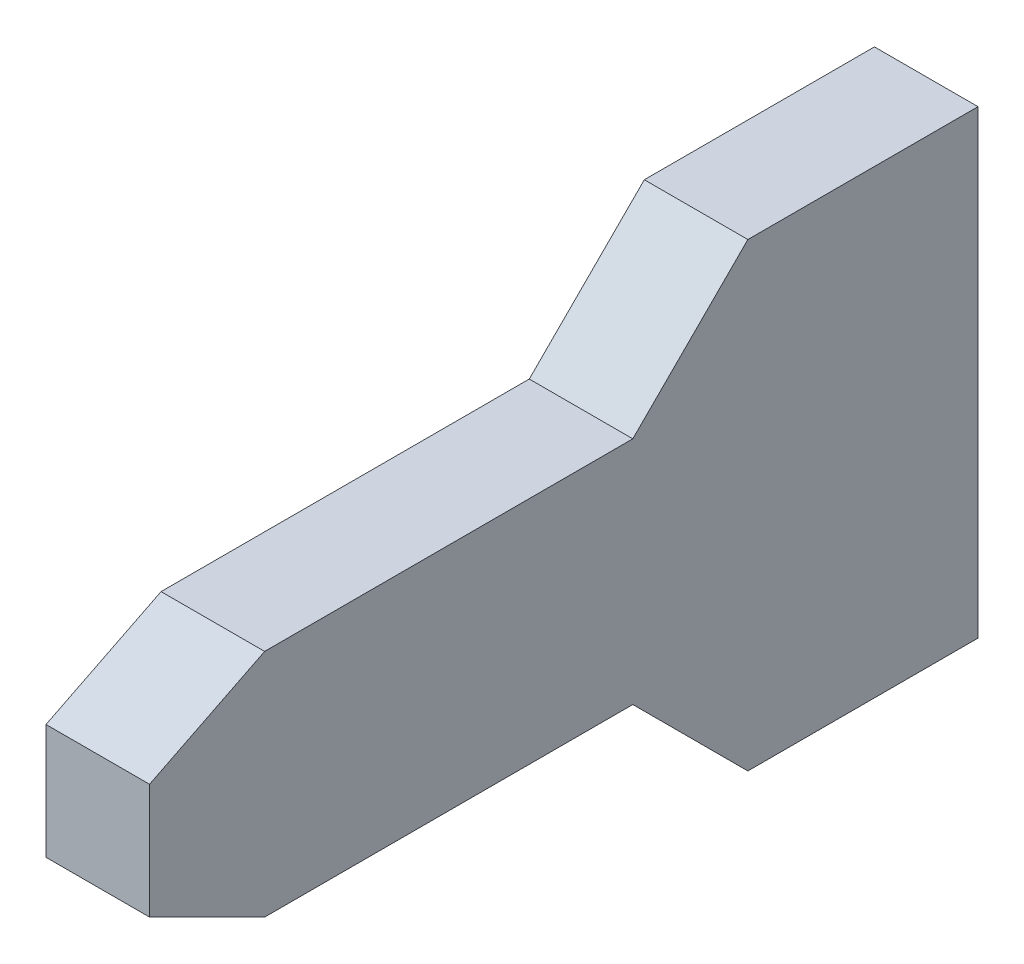
ISO-10303-21;
HEADER;
FILE_DESCRIPTION(('STEP AP214'),'2;1');
FILE_NAME('part.step','',(''),(''),'','','');
FILE_SCHEMA(('AUTOMOTIVE_DESIGN { 1 0 10303 214 1 1 1 1 }'));
ENDSEC;
DATA;
#1=APPLICATION_CONTEXT('core data for automotive mechanical design processes');
#2=APPLICATION_PROTOCOL_DEFINITION('international standard','automotive_design',2000,#1);
#3=PRODUCT_CONTEXT('',#1,'mechanical');
#4=PRODUCT('Part','Part','',(#3));
#5=PRODUCT_RELATED_PRODUCT_CATEGORY('part','',(#4));
#6=PRODUCT_DEFINITION_FORMATION('','',#4);
#7=PRODUCT_DEFINITION_CONTEXT('part definition',#1,'design');
#8=PRODUCT_DEFINITION('design','',#6,#7);
#9=PRODUCT_DEFINITION_SHAPE('','',#8);
#10=(LENGTH_UNIT() NAMED_UNIT(*) SI_UNIT(.MILLI.,.METRE.));
#11=(NAMED_UNIT(*) PLANE_ANGLE_UNIT() SI_UNIT($,.RADIAN.));
#12=(NAMED_UNIT(*) SI_UNIT($,.STERADIAN.) SOLID_ANGLE_UNIT());
#13=UNCERTAINTY_MEASURE_WITH_UNIT(LENGTH_MEASURE(1.E-05),#10,'distance_accuracy_value','');
#14=(GEOMETRIC_REPRESENTATION_CONTEXT(3) GLOBAL_UNCERTAINTY_ASSIGNED_CONTEXT((#13)) GLOBAL_UNIT_ASSIGNED_CONTEXT((#10,
#11,#12)) REPRESENTATION_CONTEXT('',''));
#15=CARTESIAN_POINT('',(0.,0.,0.));
#16=DIRECTION('',(0.,0.,1.));
#17=DIRECTION('',(1.,0.,0.));
#18=AXIS2_PLACEMENT_3D('',#15,#16,#17);
#19=CARTESIAN_POINT('',(0.45,0.,0.531743708992));
#20=DIRECTION('',(1.,0.,0.));
#21=DIRECTION('',(0.,1.,0.));
#22=AXIS2_PLACEMENT_3D('',#19,#20,#21);
#23=PLANE('',#22);
#24=DIRECTION('',(0.,-0.707106781186548,-0.707106781186547));
#25=VECTOR('',#24,1.);
#26=CARTESIAN_POINT('',(0.45,-0.5,0.5));
#27=LINE('',#26,#25);
#28=CARTESIAN_POINT('',(0.45,-0.5,0.5));
#29=VERTEX_POINT('',#28);
#30=CARTESIAN_POINT('',(0.45,-1.,0.));
#31=VERTEX_POINT('',#30);
#32=EDGE_CURVE('E123',#29,#31,#27,.T.);
#33=ORIENTED_EDGE('',*,*,#32,.T.);
#34=DIRECTION('',(0.,0.,1.));
#35=VECTOR('',#34,1.);
#36=CARTESIAN_POINT('',(0.45,-1.,0.531743708992));
#37=LINE('',#36,#35);
#38=CARTESIAN_POINT('',(0.45,-1.,-1.));
#39=VERTEX_POINT('',#38);
#40=EDGE_CURVE('E125',#31,#39,#37,.F.);
#41=ORIENTED_EDGE('',*,*,#40,.T.);
#42=DIRECTION('',(0.,1.,0.));
#43=VECTOR('',#42,1.);
#44=CARTESIAN_POINT('',(0.45,1.,-1.));
#45=LINE('',#44,#43);
#46=CARTESIAN_POINT('',(0.45,1.,-1.));
#47=VERTEX_POINT('',#46);
#48=EDGE_CURVE('E96',#47,#39,#45,.F.);
#49=ORIENTED_EDGE('',*,*,#48,.F.);
#50=DIRECTION('',(0.,0.,1.));
#51=VECTOR('',#50,1.);
#52=CARTESIAN_POINT('',(0.45,1.,0.531743708992));
#53=LINE('',#52,#51);
#54=CARTESIAN_POINT('',(0.45,1.,0.));
#55=VERTEX_POINT('',#54);
#56=EDGE_CURVE('E20',#47,#55,#53,.T.);
#57=ORIENTED_EDGE('',*,*,#56,.T.);
#58=DIRECTION('',(0.,-0.707106781186548,0.707106781186548));
#59=VECTOR('',#58,1.);
#60=CARTESIAN_POINT('',(0.450000000000001,1.,0.));
#61=LINE('',#60,#59);
#62=CARTESIAN_POINT('',(0.45,0.5,0.5));
#63=VERTEX_POINT('',#62);
#64=EDGE_CURVE('E91',#55,#63,#61,.T.);
#65=ORIENTED_EDGE('',*,*,#64,.T.);
#66=DIRECTION('',(0.,0.,1.));
#67=VECTOR('',#66,1.);
#68=CARTESIAN_POINT('',(0.45,0.5,0.531743708992));
#69=LINE('',#68,#67);
#70=CARTESIAN_POINT('',(0.45,0.5,2.1));
#71=VERTEX_POINT('',#70);
#72=EDGE_CURVE('E112',#63,#71,#69,.T.);
#73=ORIENTED_EDGE('',*,*,#72,.T.);
#74=DIRECTION('',(0.,-0.447213595499958,0.894427190999916));
#75=VECTOR('',#74,1.);
#76=CARTESIAN_POINT('',(0.45,0.5,2.1));
#77=LINE('',#76,#75);
#78=CARTESIAN_POINT('',(0.45,0.25,2.6));
#79=VERTEX_POINT('',#78);
#80=EDGE_CURVE('E113',#71,#79,#77,.T.);
#81=ORIENTED_EDGE('',*,*,#80,.T.);
#82=DIRECTION('',(0.,1.,0.));
#83=VECTOR('',#82,1.);
#84=CARTESIAN_POINT('',(0.45,0.,2.6));
#85=LINE('',#84,#83);
#86=CARTESIAN_POINT('',(0.45,-0.25,2.6));
#87=VERTEX_POINT('',#86);
#88=EDGE_CURVE('E117',#79,#87,#85,.F.);
#89=ORIENTED_EDGE('',*,*,#88,.T.);
#90=DIRECTION('',(0.,-0.447213595499958,-0.894427190999916));
#91=VECTOR('',#90,1.);
#92=CARTESIAN_POINT('',(0.45,-0.25,2.6));
#93=LINE('',#92,#91);
#94=CARTESIAN_POINT('',(0.45,-0.5,2.1));
#95=VERTEX_POINT('',#94);
#96=EDGE_CURVE('E119',#87,#95,#93,.T.);
#97=ORIENTED_EDGE('',*,*,#96,.T.);
#98=DIRECTION('',(0.,0.,1.));
#99=VECTOR('',#98,1.);
#100=CARTESIAN_POINT('',(0.45,-0.5,0.531743708992));
#101=LINE('',#100,#99);
#102=EDGE_CURVE('E121',#95,#29,#101,.F.);
#103=ORIENTED_EDGE('',*,*,#102,.T.);
#104=EDGE_LOOP('',(#33,#41,#49,#57,#65,#73,#81,#89,#97,#103));
#105=FACE_BOUND('',#104,.T.);
#106=ADVANCED_FACE('F17',(#105),#23,.T.);
#107=CARTESIAN_POINT('',(0.,1.,-1.));
#108=DIRECTION('',(0.,0.,-1.));
#109=DIRECTION('',(0.,1.,0.));
#110=AXIS2_PLACEMENT_3D('',#107,#108,#109);
#111=PLANE('',#110);
#112=DIRECTION('',(1.,0.,0.));
#113=VECTOR('',#112,1.);
#114=CARTESIAN_POINT('',(0.,-1.,-1.));
#115=LINE('',#114,#113);
#116=CARTESIAN_POINT('',(0.,-1.,-1.));
#117=VERTEX_POINT('',#116);
#118=EDGE_CURVE('E140',#117,#39,#115,.T.);
#119=ORIENTED_EDGE('',*,*,#118,.F.);
#120=DIRECTION('',(0.,1.,0.));
#121=VECTOR('',#120,1.);
#122=CARTESIAN_POINT('',(0.,0.,-1.));
#123=LINE('',#122,#121);
#124=CARTESIAN_POINT('',(0.,1.,-1.));
#125=VERTEX_POINT('',#124);
#126=EDGE_CURVE('E144',#117,#125,#123,.T.);
#127=ORIENTED_EDGE('',*,*,#126,.T.);
#128=DIRECTION('',(-1.,0.,0.));
#129=VECTOR('',#128,1.);
#130=CARTESIAN_POINT('',(0.,1.,-1.));
#131=LINE('',#130,#129);
#132=EDGE_CURVE('E108',#47,#125,#131,.T.);
#133=ORIENTED_EDGE('',*,*,#132,.F.);
#134=ORIENTED_EDGE('',*,*,#48,.T.);
#135=EDGE_LOOP('',(#119,#127,#133,#134));
#136=FACE_BOUND('',#135,.T.);
#137=ADVANCED_FACE('F198',(#136),#111,.T.);
#138=CARTESIAN_POINT('',(0.,1.,0.));
#139=DIRECTION('',(0.,1.,0.));
#140=DIRECTION('',(-1.,0.,0.));
#141=AXIS2_PLACEMENT_3D('',#138,#139,#140);
#142=PLANE('',#141);
#143=ORIENTED_EDGE('',*,*,#132,.T.);
#144=DIRECTION('',(0.,0.,1.));
#145=VECTOR('',#144,1.);
#146=CARTESIAN_POINT('',(0.,1.,0.531743708992));
#147=LINE('',#146,#145);
#148=CARTESIAN_POINT('',(0.,1.,0.));
#149=VERTEX_POINT('',#148);
#150=EDGE_CURVE('E103',#125,#149,#147,.T.);
#151=ORIENTED_EDGE('',*,*,#150,.T.);
#152=DIRECTION('',(1.,0.,0.));
#153=VECTOR('',#152,1.);
#154=CARTESIAN_POINT('',(0.,1.,0.));
#155=LINE('',#154,#153);
#156=EDGE_CURVE('E100',#55,#149,#155,.F.);
#157=ORIENTED_EDGE('',*,*,#156,.F.);
#158=ORIENTED_EDGE('',*,*,#56,.F.);
#159=EDGE_LOOP('',(#143,#151,#157,#158));
#160=FACE_BOUND('',#159,.T.);
#161=ADVANCED_FACE('F101',(#160),#142,.T.);
#162=CARTESIAN_POINT('',(0.,0.5,0.5));
#163=DIRECTION('',(0.,0.707106781186548,0.707106781186548));
#164=DIRECTION('',(0.,-0.707106781186548,0.707106781186548));
#165=AXIS2_PLACEMENT_3D('',#162,#163,#164);
#166=PLANE('',#165);
#167=ORIENTED_EDGE('',*,*,#156,.T.);
#168=DIRECTION('',(0.,-0.707106781186547,0.707106781186548));
#169=VECTOR('',#168,1.);
#170=CARTESIAN_POINT('',(0.,1.,0.));
#171=LINE('',#170,#169);
#172=CARTESIAN_POINT('',(0.,0.5,0.5));
#173=VERTEX_POINT('',#172);
#174=EDGE_CURVE('E148',#149,#173,#171,.T.);
#175=ORIENTED_EDGE('',*,*,#174,.T.);
#176=DIRECTION('',(-1.,0.,0.));
#177=VECTOR('',#176,1.);
#178=CARTESIAN_POINT('',(0.,0.499999999999999,0.5));
#179=LINE('',#178,#177);
#180=EDGE_CURVE('E107',#63,#173,#179,.T.);
#181=ORIENTED_EDGE('',*,*,#180,.F.);
#182=ORIENTED_EDGE('',*,*,#64,.F.);
#183=EDGE_LOOP('',(#167,#175,#181,#182));
#184=FACE_BOUND('',#183,.T.);
#185=ADVANCED_FACE('F110',(#184),#166,.T.);
#186=CARTESIAN_POINT('',(0.,0.5,2.1));
#187=DIRECTION('',(0.,1.,0.));
#188=DIRECTION('',(-1.,0.,0.));
#189=AXIS2_PLACEMENT_3D('',#186,#187,#188);
#190=PLANE('',#189);
#191=ORIENTED_EDGE('',*,*,#180,.T.);
#192=DIRECTION('',(0.,0.,1.));
#193=VECTOR('',#192,1.);
#194=CARTESIAN_POINT('',(0.,0.5,0.531743708992));
#195=LINE('',#194,#193);
#196=CARTESIAN_POINT('',(0.,0.5,2.1));
#197=VERTEX_POINT('',#196);
#198=EDGE_CURVE('E150',#173,#197,#195,.T.);
#199=ORIENTED_EDGE('',*,*,#198,.T.);
#200=DIRECTION('',(1.,0.,0.));
#201=VECTOR('',#200,1.);
#202=CARTESIAN_POINT('',(0.,0.5,2.1));
#203=LINE('',#202,#201);
#204=EDGE_CURVE('E130',#71,#197,#203,.F.);
#205=ORIENTED_EDGE('',*,*,#204,.F.);
#206=ORIENTED_EDGE('',*,*,#72,.F.);
#207=EDGE_LOOP('',(#191,#199,#205,#206));
#208=FACE_BOUND('',#207,.T.);
#209=ADVANCED_FACE('F195',(#208),#190,.T.);
#210=CARTESIAN_POINT('',(0.,0.25,2.6));
#211=DIRECTION('',(0.,0.894427190999916,0.447213595499958));
#212=DIRECTION('',(0.,-0.447213595499958,0.894427190999916));
#213=AXIS2_PLACEMENT_3D('',#210,#211,#212);
#214=PLANE('',#213);
#215=ORIENTED_EDGE('',*,*,#204,.T.);
#216=DIRECTION('',(0.,-0.447213595499958,0.894427190999916));
#217=VECTOR('',#216,1.);
#218=CARTESIAN_POINT('',(0.,0.5,2.1));
#219=LINE('',#218,#217);
#220=CARTESIAN_POINT('',(0.,0.25,2.6));
#221=VERTEX_POINT('',#220);
#222=EDGE_CURVE('E153',#197,#221,#219,.T.);
#223=ORIENTED_EDGE('',*,*,#222,.T.);
#224=DIRECTION('',(1.,0.,0.));
#225=VECTOR('',#224,1.);
#226=CARTESIAN_POINT('',(0.,0.25,2.6));
#227=LINE('',#226,#225);
#228=EDGE_CURVE('E132',#79,#221,#227,.F.);
#229=ORIENTED_EDGE('',*,*,#228,.F.);
#230=ORIENTED_EDGE('',*,*,#80,.F.);
#231=EDGE_LOOP('',(#215,#223,#229,#230));
#232=FACE_BOUND('',#231,.T.);
#233=ADVANCED_FACE('F191',(#232),#214,.T.);
#234=CARTESIAN_POINT('',(0.,-0.25,2.6));
#235=DIRECTION('',(0.,0.,1.));
#236=DIRECTION('',(0.,-1.,0.));
#237=AXIS2_PLACEMENT_3D('',#234,#235,#236);
#238=PLANE('',#237);
#239=ORIENTED_EDGE('',*,*,#228,.T.);
#240=DIRECTION('',(0.,1.,0.));
#241=VECTOR('',#240,1.);
#242=CARTESIAN_POINT('',(0.,0.,2.6));
#243=LINE('',#242,#241);
#244=CARTESIAN_POINT('',(0.,-0.25,2.6));
#245=VERTEX_POINT('',#244);
#246=EDGE_CURVE('E156',#221,#245,#243,.F.);
#247=ORIENTED_EDGE('',*,*,#246,.T.);
#248=DIRECTION('',(1.,0.,0.));
#249=VECTOR('',#248,1.);
#250=CARTESIAN_POINT('',(0.,-0.25,2.6));
#251=LINE('',#250,#249);
#252=EDGE_CURVE('E134',#87,#245,#251,.F.);
#253=ORIENTED_EDGE('',*,*,#252,.F.);
#254=ORIENTED_EDGE('',*,*,#88,.F.);
#255=EDGE_LOOP('',(#239,#247,#253,#254));
#256=FACE_BOUND('',#255,.T.);
#257=ADVANCED_FACE('F186',(#256),#238,.T.);
#258=CARTESIAN_POINT('',(0.,-0.5,2.1));
#259=DIRECTION('',(0.,-0.894427190999916,0.447213595499958));
#260=DIRECTION('',(0.,-0.447213595499958,-0.894427190999916));
#261=AXIS2_PLACEMENT_3D('',#258,#259,#260);
#262=PLANE('',#261);
#263=ORIENTED_EDGE('',*,*,#252,.T.);
#264=DIRECTION('',(0.,-0.447213595499958,-0.894427190999916));
#265=VECTOR('',#264,1.);
#266=CARTESIAN_POINT('',(0.,-0.25,2.6));
#267=LINE('',#266,#265);
#268=CARTESIAN_POINT('',(0.,-0.5,2.1));
#269=VERTEX_POINT('',#268);
#270=EDGE_CURVE('E159',#245,#269,#267,.T.);
#271=ORIENTED_EDGE('',*,*,#270,.T.);
#272=DIRECTION('',(1.,0.,0.));
#273=VECTOR('',#272,1.);
#274=CARTESIAN_POINT('',(0.,-0.499999999999999,2.1));
#275=LINE('',#274,#273);
#276=EDGE_CURVE('E136',#95,#269,#275,.F.);
#277=ORIENTED_EDGE('',*,*,#276,.F.);
#278=ORIENTED_EDGE('',*,*,#96,.F.);
#279=EDGE_LOOP('',(#263,#271,#277,#278));
#280=FACE_BOUND('',#279,.T.);
#281=ADVANCED_FACE('F181',(#280),#262,.T.);
#282=CARTESIAN_POINT('',(0.,-0.5,0.5));
#283=DIRECTION('',(0.,-1.,0.));
#284=DIRECTION('',(1.,0.,0.));
#285=AXIS2_PLACEMENT_3D('',#282,#283,#284);
#286=PLANE('',#285);
#287=ORIENTED_EDGE('',*,*,#276,.T.);
#288=DIRECTION('',(0.,0.,1.));
#289=VECTOR('',#288,1.);
#290=CARTESIAN_POINT('',(0.,-0.5,0.531743708992));
#291=LINE('',#290,#289);
#292=CARTESIAN_POINT('',(0.,-0.5,0.5));
#293=VERTEX_POINT('',#292);
#294=EDGE_CURVE('E162',#269,#293,#291,.F.);
#295=ORIENTED_EDGE('',*,*,#294,.T.);
#296=DIRECTION('',(1.,0.,0.));
#297=VECTOR('',#296,1.);
#298=CARTESIAN_POINT('',(0.,-0.5,0.5));
#299=LINE('',#298,#297);
#300=EDGE_CURVE('E138',#29,#293,#299,.F.);
#301=ORIENTED_EDGE('',*,*,#300,.F.);
#302=ORIENTED_EDGE('',*,*,#102,.F.);
#303=EDGE_LOOP('',(#287,#295,#301,#302));
#304=FACE_BOUND('',#303,.T.);
#305=ADVANCED_FACE('F176',(#304),#286,.T.);
#306=CARTESIAN_POINT('',(0.,-1.,0.));
#307=DIRECTION('',(0.,-0.707106781186548,0.707106781186548));
#308=DIRECTION('',(0.,-0.707106781186548,-0.707106781186548));
#309=AXIS2_PLACEMENT_3D('',#306,#307,#308);
#310=PLANE('',#309);
#311=ORIENTED_EDGE('',*,*,#300,.T.);
#312=DIRECTION('',(0.,-0.707106781186548,-0.707106781186547));
#313=VECTOR('',#312,1.);
#314=CARTESIAN_POINT('',(0.,-0.5,0.5));
#315=LINE('',#314,#313);
#316=CARTESIAN_POINT('',(0.,-1.,0.));
#317=VERTEX_POINT('',#316);
#318=EDGE_CURVE('E26',#293,#317,#315,.T.);
#319=ORIENTED_EDGE('',*,*,#318,.T.);
#320=DIRECTION('',(1.,0.,0.));
#321=VECTOR('',#320,1.);
#322=CARTESIAN_POINT('',(0.,-1.,0.));
#323=LINE('',#322,#321);
#324=EDGE_CURVE('E34',#31,#317,#323,.F.);
#325=ORIENTED_EDGE('',*,*,#324,.F.);
#326=ORIENTED_EDGE('',*,*,#32,.F.);
#327=EDGE_LOOP('',(#311,#319,#325,#326));
#328=FACE_BOUND('',#327,.T.);
#329=ADVANCED_FACE('F168',(#328),#310,.T.);
#330=CARTESIAN_POINT('',(0.,-1.,-1.));
#331=DIRECTION('',(0.,-1.,0.));
#332=DIRECTION('',(1.,0.,0.));
#333=AXIS2_PLACEMENT_3D('',#330,#331,#332);
#334=PLANE('',#333);
#335=ORIENTED_EDGE('',*,*,#324,.T.);
#336=DIRECTION('',(0.,0.,1.));
#337=VECTOR('',#336,1.);
#338=CARTESIAN_POINT('',(0.,-1.,0.531743708992));
#339=LINE('',#338,#337);
#340=EDGE_CURVE('E11',#317,#117,#339,.F.);
#341=ORIENTED_EDGE('',*,*,#340,.T.);
#342=ORIENTED_EDGE('',*,*,#118,.T.);
#343=ORIENTED_EDGE('',*,*,#40,.F.);
#344=EDGE_LOOP('',(#335,#341,#342,#343));
#345=FACE_BOUND('',#344,.T.);
#346=ADVANCED_FACE('F199',(#345),#334,.T.);
#347=CARTESIAN_POINT('',(0.,0.,0.531743708992));
#348=DIRECTION('',(1.,0.,0.));
#349=DIRECTION('',(0.,1.,0.));
#350=AXIS2_PLACEMENT_3D('',#347,#348,#349);
#351=PLANE('',#350);
#352=ORIENTED_EDGE('',*,*,#318,.F.);
#353=ORIENTED_EDGE('',*,*,#294,.F.);
#354=ORIENTED_EDGE('',*,*,#270,.F.);
#355=ORIENTED_EDGE('',*,*,#246,.F.);
#356=ORIENTED_EDGE('',*,*,#222,.F.);
#357=ORIENTED_EDGE('',*,*,#198,.F.);
#358=ORIENTED_EDGE('',*,*,#174,.F.);
#359=ORIENTED_EDGE('',*,*,#150,.F.);
#360=ORIENTED_EDGE('',*,*,#126,.F.);
#361=ORIENTED_EDGE('',*,*,#340,.F.);
#362=EDGE_LOOP('',(#352,#353,#354,#355,#356,#357,#358,#359,#360,#361));
#363=FACE_BOUND('',#362,.T.);
#364=ADVANCED_FACE('F173',(#363),#351,.F.);
#365=CLOSED_SHELL('',(#106,#137,#161,#185,#209,#233,#257,#281,#305,#329,#346,#364));
#366=MANIFOLD_SOLID_BREP('B1',#365);
#367=ADVANCED_BREP_SHAPE_REPRESENTATION('',(#18,#366),#14);
#368=SHAPE_DEFINITION_REPRESENTATION(#9,#367);
ENDSEC;
END-ISO-10303-21;
